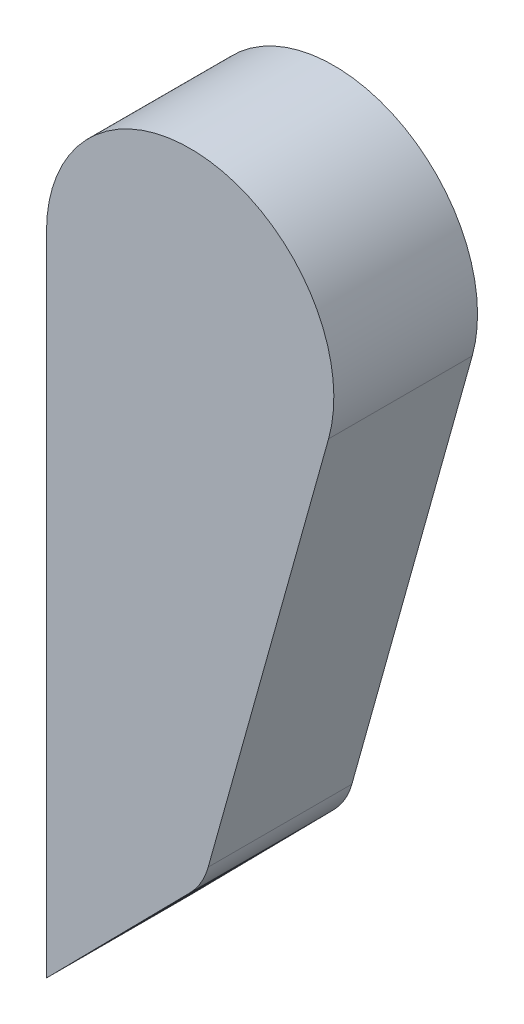
ISO-10303-21;
HEADER;
FILE_DESCRIPTION(('STEP AP214'),'2;1');
FILE_NAME('part.step','',(''),(''),'','','');
FILE_SCHEMA(('AUTOMOTIVE_DESIGN { 1 0 10303 214 1 1 1 1 }'));
ENDSEC;
DATA;
#1=APPLICATION_CONTEXT('core data for automotive mechanical design processes');
#2=APPLICATION_PROTOCOL_DEFINITION('international standard','automotive_design',2000,#1);
#3=PRODUCT_CONTEXT('',#1,'mechanical');
#4=PRODUCT('Part','Part','',(#3));
#5=PRODUCT_RELATED_PRODUCT_CATEGORY('part','',(#4));
#6=PRODUCT_DEFINITION_FORMATION('','',#4);
#7=PRODUCT_DEFINITION_CONTEXT('part definition',#1,'design');
#8=PRODUCT_DEFINITION('design','',#6,#7);
#9=PRODUCT_DEFINITION_SHAPE('','',#8);
#10=(LENGTH_UNIT() NAMED_UNIT(*) SI_UNIT(.MILLI.,.METRE.));
#11=(NAMED_UNIT(*) PLANE_ANGLE_UNIT() SI_UNIT($,.RADIAN.));
#12=(NAMED_UNIT(*) SI_UNIT($,.STERADIAN.) SOLID_ANGLE_UNIT());
#13=UNCERTAINTY_MEASURE_WITH_UNIT(LENGTH_MEASURE(1.E-05),#10,'distance_accuracy_value','');
#14=(GEOMETRIC_REPRESENTATION_CONTEXT(3) GLOBAL_UNCERTAINTY_ASSIGNED_CONTEXT((#13)) GLOBAL_UNIT_ASSIGNED_CONTEXT((#10,
#11,#12)) REPRESENTATION_CONTEXT('',''));
#15=CARTESIAN_POINT('',(0.,0.,0.));
#16=DIRECTION('',(0.,0.,1.));
#17=DIRECTION('',(1.,0.,0.));
#18=AXIS2_PLACEMENT_3D('',#15,#16,#17);
#19=CARTESIAN_POINT('',(0.,0.,20.));
#20=DIRECTION('',(0.,0.,-1.));
#21=DIRECTION('',(-1.,0.,0.));
#22=AXIS2_PLACEMENT_3D('',#19,#20,#21);
#23=CYLINDRICAL_SURFACE('',#22,20.);
#24=CARTESIAN_POINT('',(0.,0.,0.));
#25=DIRECTION('',(0.,0.,1.));
#26=DIRECTION('',(1.,0.,0.));
#27=AXIS2_PLACEMENT_3D('',#24,#25,#26);
#28=CIRCLE('',#27,20.);
#29=CARTESIAN_POINT('',(19.2631525358686,-5.37875026189721,0.));
#30=VERTEX_POINT('',#29);
#31=CARTESIAN_POINT('',(-20.,0.,0.));
#32=VERTEX_POINT('',#31);
#33=EDGE_CURVE('E108',#30,#32,#28,.T.);
#34=ORIENTED_EDGE('',*,*,#33,.T.);
#35=DIRECTION('',(0.,0.,-1.));
#36=VECTOR('',#35,1.);
#37=CARTESIAN_POINT('',(-20.,0.,20.));
#38=LINE('',#37,#36);
#39=CARTESIAN_POINT('',(-20.,0.,20.));
#40=VERTEX_POINT('',#39);
#41=EDGE_CURVE('E11',#40,#32,#38,.T.);
#42=ORIENTED_EDGE('',*,*,#41,.F.);
#43=CARTESIAN_POINT('',(0.,0.,20.));
#44=DIRECTION('',(0.,0.,1.));
#45=DIRECTION('',(1.,0.,0.));
#46=AXIS2_PLACEMENT_3D('',#43,#44,#45);
#47=CIRCLE('',#46,20.);
#48=CARTESIAN_POINT('',(19.2631525358686,-5.37875026189721,20.));
#49=VERTEX_POINT('',#48);
#50=EDGE_CURVE('E116',#49,#40,#47,.T.);
#51=ORIENTED_EDGE('',*,*,#50,.F.);
#52=DIRECTION('',(0.,0.,-1.));
#53=VECTOR('',#52,1.);
#54=CARTESIAN_POINT('',(19.2631525358686,-5.37875026189721,20.));
#55=LINE('',#54,#53);
#56=EDGE_CURVE('E104',#49,#30,#55,.T.);
#57=ORIENTED_EDGE('',*,*,#56,.T.);
#58=EDGE_LOOP('',(#34,#42,#51,#57));
#59=FACE_BOUND('',#58,.T.);
#60=ADVANCED_FACE('F34',(#59),#23,.T.);
#61=CARTESIAN_POINT('',(-20.,0.,20.));
#62=DIRECTION('',(1.,0.,0.));
#63=DIRECTION('',(0.,1.,0.));
#64=AXIS2_PLACEMENT_3D('',#61,#62,#63);
#65=PLANE('',#64);
#66=DIRECTION('',(0.,-1.,0.));
#67=VECTOR('',#66,1.);
#68=CARTESIAN_POINT('',(-20.,0.,0.));
#69=LINE('',#68,#67);
#70=CARTESIAN_POINT('',(-20.,-90.,0.));
#71=VERTEX_POINT('',#70);
#72=EDGE_CURVE('E111',#32,#71,#69,.T.);
#73=ORIENTED_EDGE('',*,*,#72,.T.);
#74=DIRECTION('',(0.,0.,-1.));
#75=VECTOR('',#74,1.);
#76=CARTESIAN_POINT('',(-20.,-90.,20.));
#77=LINE('',#76,#75);
#78=CARTESIAN_POINT('',(-20.,-90.,20.));
#79=VERTEX_POINT('',#78);
#80=EDGE_CURVE('E42',#79,#71,#77,.T.);
#81=ORIENTED_EDGE('',*,*,#80,.F.);
#82=DIRECTION('',(0.,-1.,0.));
#83=VECTOR('',#82,1.);
#84=CARTESIAN_POINT('',(-20.,0.,20.));
#85=LINE('',#84,#83);
#86=EDGE_CURVE('E84',#40,#79,#85,.T.);
#87=ORIENTED_EDGE('',*,*,#86,.F.);
#88=ORIENTED_EDGE('',*,*,#41,.T.);
#89=EDGE_LOOP('',(#73,#81,#87,#88));
#90=FACE_BOUND('',#89,.T.);
#91=ADVANCED_FACE('F135',(#90),#65,.F.);
#92=CARTESIAN_POINT('',(-20.,-90.,20.));
#93=DIRECTION('',(-0.71219128150654,0.701985454654206,0.));
#94=DIRECTION('',(-0.701985454654206,-0.71219128150654,0.));
#95=AXIS2_PLACEMENT_3D('',#92,#93,#94);
#96=PLANE('',#95);
#97=DIRECTION('',(0.701985454654206,0.71219128150654,0.));
#98=VECTOR('',#97,1.);
#99=CARTESIAN_POINT('',(-20.,-90.,0.));
#100=LINE('',#99,#98);
#101=CARTESIAN_POINT('',(0.,-69.7092296774907,0.));
#102=VERTEX_POINT('',#101);
#103=EDGE_CURVE('E99',#71,#102,#100,.T.);
#104=ORIENTED_EDGE('',*,*,#103,.T.);
#105=DIRECTION('',(0.,0.,-1.));
#106=VECTOR('',#105,1.);
#107=CARTESIAN_POINT('',(0.,-69.7092296774907,20.));
#108=LINE('',#107,#106);
#109=CARTESIAN_POINT('',(0.,-69.7092296774907,20.));
#110=VERTEX_POINT('',#109);
#111=EDGE_CURVE('E96',#110,#102,#108,.T.);
#112=ORIENTED_EDGE('',*,*,#111,.F.);
#113=DIRECTION('',(0.701985454654206,0.71219128150654,0.));
#114=VECTOR('',#113,1.);
#115=CARTESIAN_POINT('',(-20.,-90.,20.));
#116=LINE('',#115,#114);
#117=EDGE_CURVE('E88',#79,#110,#116,.T.);
#118=ORIENTED_EDGE('',*,*,#117,.F.);
#119=ORIENTED_EDGE('',*,*,#80,.T.);
#120=EDGE_LOOP('',(#104,#112,#118,#119));
#121=FACE_BOUND('',#120,.T.);
#122=ADVANCED_FACE('F97',(#121),#96,.F.);
#123=CARTESIAN_POINT('',(-7.12191281506539,-62.6893751309486,20.));
#124=DIRECTION('',(0.,0.,-1.));
#125=DIRECTION('',(-1.,0.,0.));
#126=AXIS2_PLACEMENT_3D('',#123,#124,#125);
#127=CYLINDRICAL_SURFACE('',#126,10.);
#128=CARTESIAN_POINT('',(-7.12191281506539,-62.6893751309486,0.));
#129=DIRECTION('',(0.,0.,1.));
#130=DIRECTION('',(1.,0.,0.));
#131=AXIS2_PLACEMENT_3D('',#128,#129,#130);
#132=CIRCLE('',#131,10.);
#133=CARTESIAN_POINT('',(2.5096634528689,-65.3787502618972,0.));
#134=VERTEX_POINT('',#133);
#135=EDGE_CURVE('E70',#102,#134,#132,.T.);
#136=ORIENTED_EDGE('',*,*,#135,.T.);
#137=DIRECTION('',(0.,0.,-1.));
#138=VECTOR('',#137,1.);
#139=CARTESIAN_POINT('',(2.5096634528689,-65.3787502618972,20.));
#140=LINE('',#139,#138);
#141=CARTESIAN_POINT('',(2.5096634528689,-65.3787502618972,20.));
#142=VERTEX_POINT('',#141);
#143=EDGE_CURVE('E100',#142,#134,#140,.T.);
#144=ORIENTED_EDGE('',*,*,#143,.F.);
#145=CARTESIAN_POINT('',(-7.12191281506539,-62.6893751309486,20.));
#146=DIRECTION('',(0.,0.,1.));
#147=DIRECTION('',(1.,0.,0.));
#148=AXIS2_PLACEMENT_3D('',#145,#146,#147);
#149=CIRCLE('',#148,10.);
#150=EDGE_CURVE('E92',#110,#142,#149,.T.);
#151=ORIENTED_EDGE('',*,*,#150,.F.);
#152=ORIENTED_EDGE('',*,*,#111,.T.);
#153=EDGE_LOOP('',(#136,#144,#151,#152));
#154=FACE_BOUND('',#153,.T.);
#155=ADVANCED_FACE('F102',(#154),#127,.T.);
#156=CARTESIAN_POINT('',(2.5096634528689,-65.3787502618972,20.));
#157=DIRECTION('',(-0.96315762679343,0.26893751309486,0.));
#158=DIRECTION('',(-0.26893751309486,-0.96315762679343,0.));
#159=AXIS2_PLACEMENT_3D('',#156,#157,#158);
#160=PLANE('',#159);
#161=DIRECTION('',(0.26893751309486,0.96315762679343,0.));
#162=VECTOR('',#161,1.);
#163=CARTESIAN_POINT('',(2.5096634528689,-65.3787502618972,0.));
#164=LINE('',#163,#162);
#165=EDGE_CURVE('E76',#134,#30,#164,.T.);
#166=ORIENTED_EDGE('',*,*,#165,.T.);
#167=ORIENTED_EDGE('',*,*,#56,.F.);
#168=DIRECTION('',(0.26893751309486,0.96315762679343,0.));
#169=VECTOR('',#168,1.);
#170=CARTESIAN_POINT('',(2.5096634528689,-65.3787502618972,20.));
#171=LINE('',#170,#169);
#172=EDGE_CURVE('E50',#142,#49,#171,.T.);
#173=ORIENTED_EDGE('',*,*,#172,.F.);
#174=ORIENTED_EDGE('',*,*,#143,.T.);
#175=EDGE_LOOP('',(#166,#167,#173,#174));
#176=FACE_BOUND('',#175,.T.);
#177=ADVANCED_FACE('F124',(#176),#160,.F.);
#178=CARTESIAN_POINT('',(0.,0.,20.));
#179=DIRECTION('',(0.,0.,1.));
#180=DIRECTION('',(1.,0.,0.));
#181=AXIS2_PLACEMENT_3D('',#178,#179,#180);
#182=PLANE('',#181);
#183=ORIENTED_EDGE('',*,*,#50,.T.);
#184=ORIENTED_EDGE('',*,*,#86,.T.);
#185=ORIENTED_EDGE('',*,*,#117,.T.);
#186=ORIENTED_EDGE('',*,*,#150,.T.);
#187=ORIENTED_EDGE('',*,*,#172,.T.);
#188=EDGE_LOOP('',(#183,#184,#185,#186,#187));
#189=FACE_BOUND('',#188,.T.);
#190=ADVANCED_FACE('F90',(#189),#182,.T.);
#191=CARTESIAN_POINT('',(0.,0.,0.));
#192=DIRECTION('',(0.,0.,1.));
#193=DIRECTION('',(1.,0.,0.));
#194=AXIS2_PLACEMENT_3D('',#191,#192,#193);
#195=PLANE('',#194);
#196=ORIENTED_EDGE('',*,*,#33,.F.);
#197=ORIENTED_EDGE('',*,*,#165,.F.);
#198=ORIENTED_EDGE('',*,*,#135,.F.);
#199=ORIENTED_EDGE('',*,*,#103,.F.);
#200=ORIENTED_EDGE('',*,*,#72,.F.);
#201=EDGE_LOOP('',(#196,#197,#198,#199,#200));
#202=FACE_BOUND('',#201,.T.);
#203=ADVANCED_FACE('F120',(#202),#195,.F.);
#204=CLOSED_SHELL('',(#60,#91,#122,#155,#177,#190,#203));
#205=MANIFOLD_SOLID_BREP('B2',#204);
#206=ADVANCED_BREP_SHAPE_REPRESENTATION('',(#18,#205),#14);
#207=SHAPE_DEFINITION_REPRESENTATION(#9,#206);
ENDSEC;
END-ISO-10303-21;
